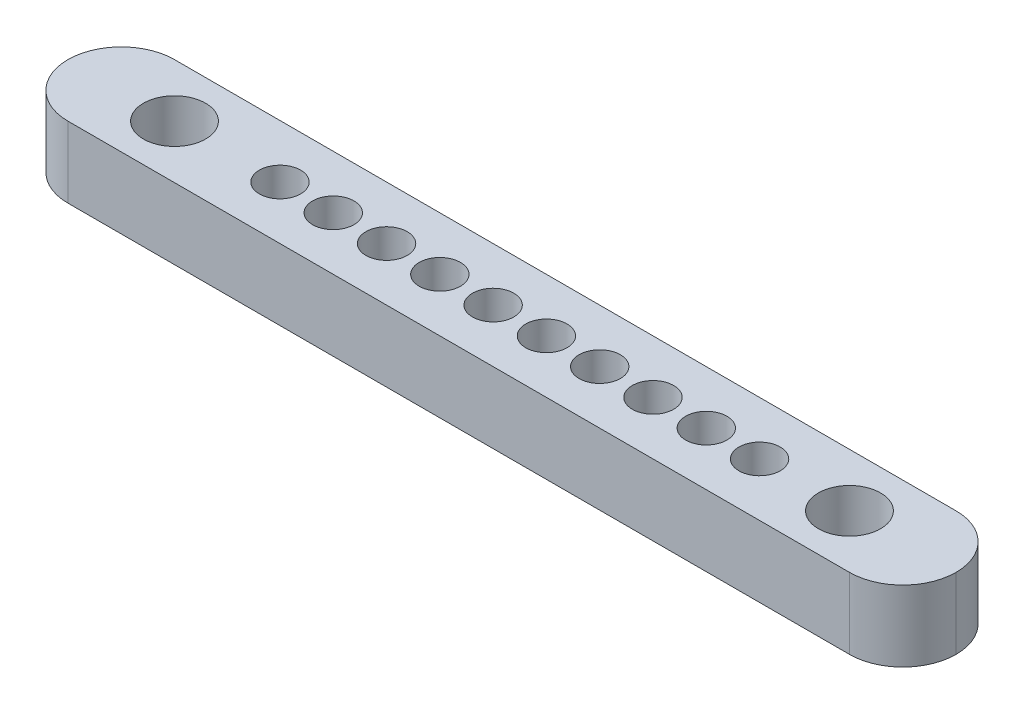
ISO-10303-21;
HEADER;
FILE_DESCRIPTION(('STEP AP214'),'2;1');
FILE_NAME('part.step','',(''),(''),'','','');
FILE_SCHEMA(('AUTOMOTIVE_DESIGN { 1 0 10303 214 1 1 1 1 }'));
ENDSEC;
DATA;
#1=APPLICATION_CONTEXT('core data for automotive mechanical design processes');
#2=APPLICATION_PROTOCOL_DEFINITION('international standard','automotive_design',2000,#1);
#3=PRODUCT_CONTEXT('',#1,'mechanical');
#4=PRODUCT('Part','Part','',(#3));
#5=PRODUCT_RELATED_PRODUCT_CATEGORY('part','',(#4));
#6=PRODUCT_DEFINITION_FORMATION('','',#4);
#7=PRODUCT_DEFINITION_CONTEXT('part definition',#1,'design');
#8=PRODUCT_DEFINITION('design','',#6,#7);
#9=PRODUCT_DEFINITION_SHAPE('','',#8);
#10=(LENGTH_UNIT() NAMED_UNIT(*) SI_UNIT(.MILLI.,.METRE.));
#11=(NAMED_UNIT(*) PLANE_ANGLE_UNIT() SI_UNIT($,.RADIAN.));
#12=(NAMED_UNIT(*) SI_UNIT($,.STERADIAN.) SOLID_ANGLE_UNIT());
#13=UNCERTAINTY_MEASURE_WITH_UNIT(LENGTH_MEASURE(1.E-05),#10,'distance_accuracy_value','');
#14=(GEOMETRIC_REPRESENTATION_CONTEXT(3) GLOBAL_UNCERTAINTY_ASSIGNED_CONTEXT((#13)) GLOBAL_UNIT_ASSIGNED_CONTEXT((#10,
#11,#12)) REPRESENTATION_CONTEXT('',''));
#15=CARTESIAN_POINT('',(0.,0.,0.));
#16=DIRECTION('',(0.,0.,1.));
#17=DIRECTION('',(1.,0.,0.));
#18=AXIS2_PLACEMENT_3D('',#15,#16,#17);
#19=CARTESIAN_POINT('',(0.,4.,0.));
#20=DIRECTION('',(0.,1.,0.));
#21=DIRECTION('',(0.,0.,1.));
#22=AXIS2_PLACEMENT_3D('',#19,#20,#21);
#23=PLANE('',#22);
#24=CARTESIAN_POINT('',(10.937984496124,4.,0.));
#25=DIRECTION('',(0.,1.,0.));
#26=DIRECTION('',(0.,0.,1.));
#27=AXIS2_PLACEMENT_3D('',#24,#25,#26);
#28=CIRCLE('',#27,1.16279069767442);
#29=CARTESIAN_POINT('',(10.937984496124,4.,1.16279069767442));
#30=VERTEX_POINT('',#29);
#31=EDGE_CURVE('E160',#30,#30,#28,.T.);
#32=ORIENTED_EDGE('',*,*,#31,.F.);
#33=EDGE_LOOP('',(#32));
#34=FACE_BOUND('',#33,.T.);
#35=CARTESIAN_POINT('',(4.93798449612403,4.,0.));
#36=DIRECTION('',(0.,1.,0.));
#37=DIRECTION('',(0.,0.,1.));
#38=AXIS2_PLACEMENT_3D('',#35,#36,#37);
#39=CIRCLE('',#38,1.16279069767442);
#40=CARTESIAN_POINT('',(4.93798449612403,4.,1.16279069767442));
#41=VERTEX_POINT('',#40);
#42=EDGE_CURVE('E176',#41,#41,#39,.T.);
#43=ORIENTED_EDGE('',*,*,#42,.F.);
#44=EDGE_LOOP('',(#43));
#45=FACE_BOUND('',#44,.T.);
#46=CARTESIAN_POINT('',(-1.06201550387597,4.,0.));
#47=DIRECTION('',(0.,1.,0.));
#48=DIRECTION('',(0.,0.,1.));
#49=AXIS2_PLACEMENT_3D('',#46,#47,#48);
#50=CIRCLE('',#49,1.16279069767442);
#51=CARTESIAN_POINT('',(-1.06201550387597,4.,1.16279069767442));
#52=VERTEX_POINT('',#51);
#53=EDGE_CURVE('E192',#52,#52,#50,.T.);
#54=ORIENTED_EDGE('',*,*,#53,.F.);
#55=EDGE_LOOP('',(#54));
#56=FACE_BOUND('',#55,.T.);
#57=CARTESIAN_POINT('',(-7.06201550387597,4.,0.));
#58=DIRECTION('',(0.,1.,0.));
#59=DIRECTION('',(0.,0.,1.));
#60=AXIS2_PLACEMENT_3D('',#57,#58,#59);
#61=CIRCLE('',#60,1.16279069767442);
#62=CARTESIAN_POINT('',(-7.06201550387597,4.,1.16279069767442));
#63=VERTEX_POINT('',#62);
#64=EDGE_CURVE('E208',#63,#63,#61,.T.);
#65=ORIENTED_EDGE('',*,*,#64,.F.);
#66=EDGE_LOOP('',(#65));
#67=FACE_BOUND('',#66,.T.);
#68=CARTESIAN_POINT('',(-13.062015503876,4.,0.));
#69=DIRECTION('',(0.,1.,0.));
#70=DIRECTION('',(0.,0.,1.));
#71=AXIS2_PLACEMENT_3D('',#68,#69,#70);
#72=CIRCLE('',#71,1.16279069767442);
#73=CARTESIAN_POINT('',(-13.062015503876,4.,1.16279069767442));
#74=VERTEX_POINT('',#73);
#75=EDGE_CURVE('E224',#74,#74,#72,.T.);
#76=ORIENTED_EDGE('',*,*,#75,.F.);
#77=EDGE_LOOP('',(#76));
#78=FACE_BOUND('',#77,.T.);
#79=CARTESIAN_POINT('',(-19.,4.,0.));
#80=DIRECTION('',(0.,1.,0.));
#81=DIRECTION('',(0.,0.,1.));
#82=AXIS2_PLACEMENT_3D('',#79,#80,#81);
#83=CIRCLE('',#82,1.75);
#84=CARTESIAN_POINT('',(-19.,4.,1.75));
#85=VERTEX_POINT('',#84);
#86=EDGE_CURVE('E240',#85,#85,#83,.T.);
#87=ORIENTED_EDGE('',*,*,#86,.F.);
#88=EDGE_LOOP('',(#87));
#89=FACE_BOUND('',#88,.T.);
#90=DIRECTION('',(1.,0.,0.));
#91=VECTOR('',#90,1.);
#92=CARTESIAN_POINT('',(25.,4.,3.));
#93=LINE('',#92,#91);
#94=CARTESIAN_POINT('',(-22.,4.,3.));
#95=VERTEX_POINT('',#94);
#96=CARTESIAN_POINT('',(22.,4.,3.));
#97=VERTEX_POINT('',#96);
#98=EDGE_CURVE('E247',#95,#97,#93,.T.);
#99=ORIENTED_EDGE('',*,*,#98,.T.);
#100=CARTESIAN_POINT('',(22.,4.,0.));
#101=DIRECTION('',(0.,1.,0.));
#102=DIRECTION('',(0.,0.,1.));
#103=AXIS2_PLACEMENT_3D('',#100,#101,#102);
#104=CIRCLE('',#103,3.);
#105=CARTESIAN_POINT('',(25.,4.,0.));
#106=VERTEX_POINT('',#105);
#107=EDGE_CURVE('E139',#97,#106,#104,.T.);
#108=ORIENTED_EDGE('',*,*,#107,.T.);
#109=CARTESIAN_POINT('',(22.,4.,0.));
#110=DIRECTION('',(0.,1.,0.));
#111=DIRECTION('',(0.,0.,1.));
#112=AXIS2_PLACEMENT_3D('',#109,#110,#111);
#113=CIRCLE('',#112,3.);
#114=CARTESIAN_POINT('',(22.,4.,-3.));
#115=VERTEX_POINT('',#114);
#116=EDGE_CURVE('E65',#106,#115,#113,.T.);
#117=ORIENTED_EDGE('',*,*,#116,.T.);
#118=DIRECTION('',(-1.,0.,0.));
#119=VECTOR('',#118,1.);
#120=CARTESIAN_POINT('',(25.,4.,-3.));
#121=LINE('',#120,#119);
#122=CARTESIAN_POINT('',(-22.,4.,-3.));
#123=VERTEX_POINT('',#122);
#124=EDGE_CURVE('E109',#115,#123,#121,.T.);
#125=ORIENTED_EDGE('',*,*,#124,.T.);
#126=CARTESIAN_POINT('',(-22.,4.,0.));
#127=DIRECTION('',(0.,1.,0.));
#128=DIRECTION('',(0.,0.,1.));
#129=AXIS2_PLACEMENT_3D('',#126,#127,#128);
#130=CIRCLE('',#129,3.);
#131=CARTESIAN_POINT('',(-25.,4.,0.));
#132=VERTEX_POINT('',#131);
#133=EDGE_CURVE('E57',#123,#132,#130,.T.);
#134=ORIENTED_EDGE('',*,*,#133,.T.);
#135=CARTESIAN_POINT('',(-22.,4.,0.));
#136=DIRECTION('',(0.,1.,0.));
#137=DIRECTION('',(0.,0.,1.));
#138=AXIS2_PLACEMENT_3D('',#135,#136,#137);
#139=CIRCLE('',#138,3.);
#140=EDGE_CURVE('E112',#132,#95,#139,.T.);
#141=ORIENTED_EDGE('',*,*,#140,.T.);
#142=EDGE_LOOP('',(#99,#108,#117,#125,#134,#141));
#143=FACE_BOUND('',#142,.T.);
#144=CARTESIAN_POINT('',(19.,4.,0.));
#145=DIRECTION('',(0.,1.,0.));
#146=DIRECTION('',(0.,0.,1.));
#147=AXIS2_PLACEMENT_3D('',#144,#145,#146);
#148=CIRCLE('',#147,1.75);
#149=CARTESIAN_POINT('',(19.,4.,1.75));
#150=VERTEX_POINT('',#149);
#151=EDGE_CURVE('E232',#150,#150,#148,.T.);
#152=ORIENTED_EDGE('',*,*,#151,.F.);
#153=EDGE_LOOP('',(#152));
#154=FACE_BOUND('',#153,.T.);
#155=CARTESIAN_POINT('',(-10.062015503876,4.,0.));
#156=DIRECTION('',(0.,1.,0.));
#157=DIRECTION('',(0.,0.,1.));
#158=AXIS2_PLACEMENT_3D('',#155,#156,#157);
#159=CIRCLE('',#158,1.16279069767442);
#160=CARTESIAN_POINT('',(-10.062015503876,4.,1.16279069767442));
#161=VERTEX_POINT('',#160);
#162=EDGE_CURVE('E216',#161,#161,#159,.T.);
#163=ORIENTED_EDGE('',*,*,#162,.F.);
#164=EDGE_LOOP('',(#163));
#165=FACE_BOUND('',#164,.T.);
#166=CARTESIAN_POINT('',(-4.06201550387597,4.,0.));
#167=DIRECTION('',(0.,1.,0.));
#168=DIRECTION('',(0.,0.,1.));
#169=AXIS2_PLACEMENT_3D('',#166,#167,#168);
#170=CIRCLE('',#169,1.16279069767442);
#171=CARTESIAN_POINT('',(-4.06201550387597,4.,1.16279069767442));
#172=VERTEX_POINT('',#171);
#173=EDGE_CURVE('E200',#172,#172,#170,.T.);
#174=ORIENTED_EDGE('',*,*,#173,.F.);
#175=EDGE_LOOP('',(#174));
#176=FACE_BOUND('',#175,.T.);
#177=CARTESIAN_POINT('',(1.93798449612403,4.,0.));
#178=DIRECTION('',(0.,1.,0.));
#179=DIRECTION('',(0.,0.,1.));
#180=AXIS2_PLACEMENT_3D('',#177,#178,#179);
#181=CIRCLE('',#180,1.16279069767442);
#182=CARTESIAN_POINT('',(1.93798449612403,4.,1.16279069767442));
#183=VERTEX_POINT('',#182);
#184=EDGE_CURVE('E184',#183,#183,#181,.T.);
#185=ORIENTED_EDGE('',*,*,#184,.F.);
#186=EDGE_LOOP('',(#185));
#187=FACE_BOUND('',#186,.T.);
#188=CARTESIAN_POINT('',(7.93798449612403,4.,0.));
#189=DIRECTION('',(0.,1.,0.));
#190=DIRECTION('',(0.,0.,1.));
#191=AXIS2_PLACEMENT_3D('',#188,#189,#190);
#192=CIRCLE('',#191,1.16279069767442);
#193=CARTESIAN_POINT('',(7.93798449612403,4.,1.16279069767442));
#194=VERTEX_POINT('',#193);
#195=EDGE_CURVE('E168',#194,#194,#192,.T.);
#196=ORIENTED_EDGE('',*,*,#195,.F.);
#197=EDGE_LOOP('',(#196));
#198=FACE_BOUND('',#197,.T.);
#199=CARTESIAN_POINT('',(13.937984496124,4.,0.));
#200=DIRECTION('',(0.,1.,0.));
#201=DIRECTION('',(0.,0.,1.));
#202=AXIS2_PLACEMENT_3D('',#199,#200,#201);
#203=CIRCLE('',#202,1.16279069767442);
#204=CARTESIAN_POINT('',(13.937984496124,4.,1.16279069767442));
#205=VERTEX_POINT('',#204);
#206=EDGE_CURVE('E151',#205,#205,#203,.T.);
#207=ORIENTED_EDGE('',*,*,#206,.F.);
#208=EDGE_LOOP('',(#207));
#209=FACE_BOUND('',#208,.T.);
#210=ADVANCED_FACE('F39',(#34,#45,#56,#67,#78,#89,#143,#154,#165,#176,#187,#198,#209),#23,.T.);
#211=CARTESIAN_POINT('',(0.,0.,0.));
#212=DIRECTION('',(0.,1.,0.));
#213=DIRECTION('',(0.,0.,1.));
#214=AXIS2_PLACEMENT_3D('',#211,#212,#213);
#215=PLANE('',#214);
#216=CARTESIAN_POINT('',(22.,0.,0.));
#217=DIRECTION('',(0.,1.,0.));
#218=DIRECTION('',(0.,0.,1.));
#219=AXIS2_PLACEMENT_3D('',#216,#217,#218);
#220=CIRCLE('',#219,3.);
#221=CARTESIAN_POINT('',(22.,0.,-3.));
#222=VERTEX_POINT('',#221);
#223=CARTESIAN_POINT('',(25.,0.,0.));
#224=VERTEX_POINT('',#223);
#225=EDGE_CURVE('E117',#222,#224,#220,.F.);
#226=ORIENTED_EDGE('',*,*,#225,.T.);
#227=CARTESIAN_POINT('',(22.,0.,0.));
#228=DIRECTION('',(0.,1.,0.));
#229=DIRECTION('',(0.,0.,1.));
#230=AXIS2_PLACEMENT_3D('',#227,#228,#229);
#231=CIRCLE('',#230,3.);
#232=CARTESIAN_POINT('',(22.,0.,3.));
#233=VERTEX_POINT('',#232);
#234=EDGE_CURVE('E120',#224,#233,#231,.F.);
#235=ORIENTED_EDGE('',*,*,#234,.T.);
#236=DIRECTION('',(1.,0.,0.));
#237=VECTOR('',#236,1.);
#238=CARTESIAN_POINT('',(25.,0.,3.));
#239=LINE('',#238,#237);
#240=CARTESIAN_POINT('',(-22.,0.,3.));
#241=VERTEX_POINT('',#240);
#242=EDGE_CURVE('E105',#241,#233,#239,.T.);
#243=ORIENTED_EDGE('',*,*,#242,.F.);
#244=CARTESIAN_POINT('',(-22.,0.,0.));
#245=DIRECTION('',(0.,1.,0.));
#246=DIRECTION('',(0.,0.,1.));
#247=AXIS2_PLACEMENT_3D('',#244,#245,#246);
#248=CIRCLE('',#247,3.);
#249=CARTESIAN_POINT('',(-25.,0.,0.));
#250=VERTEX_POINT('',#249);
#251=EDGE_CURVE('E96',#241,#250,#248,.F.);
#252=ORIENTED_EDGE('',*,*,#251,.T.);
#253=CARTESIAN_POINT('',(-22.,0.,0.));
#254=DIRECTION('',(0.,1.,0.));
#255=DIRECTION('',(0.,0.,1.));
#256=AXIS2_PLACEMENT_3D('',#253,#254,#255);
#257=CIRCLE('',#256,3.);
#258=CARTESIAN_POINT('',(-22.,0.,-3.));
#259=VERTEX_POINT('',#258);
#260=EDGE_CURVE('E102',#250,#259,#257,.F.);
#261=ORIENTED_EDGE('',*,*,#260,.T.);
#262=DIRECTION('',(-1.,0.,0.));
#263=VECTOR('',#262,1.);
#264=CARTESIAN_POINT('',(25.,0.,-3.));
#265=LINE('',#264,#263);
#266=EDGE_CURVE('E251',#222,#259,#265,.T.);
#267=ORIENTED_EDGE('',*,*,#266,.F.);
#268=EDGE_LOOP('',(#226,#235,#243,#252,#261,#267));
#269=FACE_BOUND('',#268,.T.);
#270=CARTESIAN_POINT('',(-19.,0.,0.));
#271=DIRECTION('',(0.,1.,0.));
#272=DIRECTION('',(0.,0.,1.));
#273=AXIS2_PLACEMENT_3D('',#270,#271,#272);
#274=CIRCLE('',#273,1.75);
#275=CARTESIAN_POINT('',(-19.,0.,1.75));
#276=VERTEX_POINT('',#275);
#277=EDGE_CURVE('E236',#276,#276,#274,.T.);
#278=ORIENTED_EDGE('',*,*,#277,.T.);
#279=EDGE_LOOP('',(#278));
#280=FACE_BOUND('',#279,.T.);
#281=CARTESIAN_POINT('',(19.,0.,0.));
#282=DIRECTION('',(0.,1.,0.));
#283=DIRECTION('',(0.,0.,1.));
#284=AXIS2_PLACEMENT_3D('',#281,#282,#283);
#285=CIRCLE('',#284,1.75);
#286=CARTESIAN_POINT('',(19.,0.,1.75));
#287=VERTEX_POINT('',#286);
#288=EDGE_CURVE('E228',#287,#287,#285,.T.);
#289=ORIENTED_EDGE('',*,*,#288,.T.);
#290=EDGE_LOOP('',(#289));
#291=FACE_BOUND('',#290,.T.);
#292=CARTESIAN_POINT('',(-13.062015503876,0.,0.));
#293=DIRECTION('',(0.,1.,0.));
#294=DIRECTION('',(0.,0.,1.));
#295=AXIS2_PLACEMENT_3D('',#292,#293,#294);
#296=CIRCLE('',#295,1.16279069767442);
#297=CARTESIAN_POINT('',(-13.062015503876,0.,1.16279069767442));
#298=VERTEX_POINT('',#297);
#299=EDGE_CURVE('E220',#298,#298,#296,.T.);
#300=ORIENTED_EDGE('',*,*,#299,.T.);
#301=EDGE_LOOP('',(#300));
#302=FACE_BOUND('',#301,.T.);
#303=CARTESIAN_POINT('',(-10.062015503876,0.,0.));
#304=DIRECTION('',(0.,1.,0.));
#305=DIRECTION('',(0.,0.,1.));
#306=AXIS2_PLACEMENT_3D('',#303,#304,#305);
#307=CIRCLE('',#306,1.16279069767442);
#308=CARTESIAN_POINT('',(-10.062015503876,0.,1.16279069767442));
#309=VERTEX_POINT('',#308);
#310=EDGE_CURVE('E212',#309,#309,#307,.T.);
#311=ORIENTED_EDGE('',*,*,#310,.T.);
#312=EDGE_LOOP('',(#311));
#313=FACE_BOUND('',#312,.T.);
#314=CARTESIAN_POINT('',(-7.06201550387597,0.,0.));
#315=DIRECTION('',(0.,1.,0.));
#316=DIRECTION('',(0.,0.,1.));
#317=AXIS2_PLACEMENT_3D('',#314,#315,#316);
#318=CIRCLE('',#317,1.16279069767442);
#319=CARTESIAN_POINT('',(-7.06201550387597,0.,1.16279069767442));
#320=VERTEX_POINT('',#319);
#321=EDGE_CURVE('E204',#320,#320,#318,.T.);
#322=ORIENTED_EDGE('',*,*,#321,.T.);
#323=EDGE_LOOP('',(#322));
#324=FACE_BOUND('',#323,.T.);
#325=CARTESIAN_POINT('',(-4.06201550387597,0.,0.));
#326=DIRECTION('',(0.,1.,0.));
#327=DIRECTION('',(0.,0.,1.));
#328=AXIS2_PLACEMENT_3D('',#325,#326,#327);
#329=CIRCLE('',#328,1.16279069767442);
#330=CARTESIAN_POINT('',(-4.06201550387597,0.,1.16279069767442));
#331=VERTEX_POINT('',#330);
#332=EDGE_CURVE('E196',#331,#331,#329,.T.);
#333=ORIENTED_EDGE('',*,*,#332,.T.);
#334=EDGE_LOOP('',(#333));
#335=FACE_BOUND('',#334,.T.);
#336=CARTESIAN_POINT('',(-1.06201550387597,0.,0.));
#337=DIRECTION('',(0.,1.,0.));
#338=DIRECTION('',(0.,0.,1.));
#339=AXIS2_PLACEMENT_3D('',#336,#337,#338);
#340=CIRCLE('',#339,1.16279069767442);
#341=CARTESIAN_POINT('',(-1.06201550387597,0.,1.16279069767442));
#342=VERTEX_POINT('',#341);
#343=EDGE_CURVE('E188',#342,#342,#340,.T.);
#344=ORIENTED_EDGE('',*,*,#343,.T.);
#345=EDGE_LOOP('',(#344));
#346=FACE_BOUND('',#345,.T.);
#347=CARTESIAN_POINT('',(1.93798449612403,0.,0.));
#348=DIRECTION('',(0.,1.,0.));
#349=DIRECTION('',(0.,0.,1.));
#350=AXIS2_PLACEMENT_3D('',#347,#348,#349);
#351=CIRCLE('',#350,1.16279069767442);
#352=CARTESIAN_POINT('',(1.93798449612403,0.,1.16279069767442));
#353=VERTEX_POINT('',#352);
#354=EDGE_CURVE('E180',#353,#353,#351,.T.);
#355=ORIENTED_EDGE('',*,*,#354,.T.);
#356=EDGE_LOOP('',(#355));
#357=FACE_BOUND('',#356,.T.);
#358=CARTESIAN_POINT('',(4.93798449612403,0.,0.));
#359=DIRECTION('',(0.,1.,0.));
#360=DIRECTION('',(0.,0.,1.));
#361=AXIS2_PLACEMENT_3D('',#358,#359,#360);
#362=CIRCLE('',#361,1.16279069767442);
#363=CARTESIAN_POINT('',(4.93798449612403,0.,1.16279069767442));
#364=VERTEX_POINT('',#363);
#365=EDGE_CURVE('E172',#364,#364,#362,.T.);
#366=ORIENTED_EDGE('',*,*,#365,.T.);
#367=EDGE_LOOP('',(#366));
#368=FACE_BOUND('',#367,.T.);
#369=CARTESIAN_POINT('',(7.93798449612403,0.,0.));
#370=DIRECTION('',(0.,1.,0.));
#371=DIRECTION('',(0.,0.,1.));
#372=AXIS2_PLACEMENT_3D('',#369,#370,#371);
#373=CIRCLE('',#372,1.16279069767442);
#374=CARTESIAN_POINT('',(7.93798449612403,0.,1.16279069767442));
#375=VERTEX_POINT('',#374);
#376=EDGE_CURVE('E164',#375,#375,#373,.T.);
#377=ORIENTED_EDGE('',*,*,#376,.T.);
#378=EDGE_LOOP('',(#377));
#379=FACE_BOUND('',#378,.T.);
#380=CARTESIAN_POINT('',(10.937984496124,0.,0.));
#381=DIRECTION('',(0.,1.,0.));
#382=DIRECTION('',(0.,0.,1.));
#383=AXIS2_PLACEMENT_3D('',#380,#381,#382);
#384=CIRCLE('',#383,1.16279069767442);
#385=CARTESIAN_POINT('',(10.937984496124,0.,1.16279069767442));
#386=VERTEX_POINT('',#385);
#387=EDGE_CURVE('E157',#386,#386,#384,.T.);
#388=ORIENTED_EDGE('',*,*,#387,.T.);
#389=EDGE_LOOP('',(#388));
#390=FACE_BOUND('',#389,.T.);
#391=CARTESIAN_POINT('',(13.937984496124,0.,0.));
#392=DIRECTION('',(0.,1.,0.));
#393=DIRECTION('',(0.,0.,1.));
#394=AXIS2_PLACEMENT_3D('',#391,#392,#393);
#395=CIRCLE('',#394,1.16279069767442);
#396=CARTESIAN_POINT('',(13.937984496124,0.,1.16279069767442));
#397=VERTEX_POINT('',#396);
#398=EDGE_CURVE('E145',#397,#397,#395,.T.);
#399=ORIENTED_EDGE('',*,*,#398,.T.);
#400=EDGE_LOOP('',(#399));
#401=FACE_BOUND('',#400,.T.);
#402=ADVANCED_FACE('F98',(#269,#280,#291,#302,#313,#324,#335,#346,#357,#368,#379,#390,#401),
#215,.F.);
#403=CARTESIAN_POINT('',(25.,4.,3.));
#404=DIRECTION('',(0.,0.,-1.));
#405=DIRECTION('',(-1.,0.,0.));
#406=AXIS2_PLACEMENT_3D('',#403,#404,#405);
#407=PLANE('',#406);
#408=ORIENTED_EDGE('',*,*,#242,.T.);
#409=DIRECTION('',(0.,-1.,0.));
#410=VECTOR('',#409,1.);
#411=CARTESIAN_POINT('',(22.,4.,3.));
#412=LINE('',#411,#410);
#413=EDGE_CURVE('E129',#233,#97,#412,.F.);
#414=ORIENTED_EDGE('',*,*,#413,.T.);
#415=ORIENTED_EDGE('',*,*,#98,.F.);
#416=DIRECTION('',(0.,-1.,0.));
#417=VECTOR('',#416,1.);
#418=CARTESIAN_POINT('',(-22.,4.,3.));
#419=LINE('',#418,#417);
#420=EDGE_CURVE('E126',#95,#241,#419,.T.);
#421=ORIENTED_EDGE('',*,*,#420,.T.);
#422=EDGE_LOOP('',(#408,#414,#415,#421));
#423=FACE_BOUND('',#422,.T.);
#424=ADVANCED_FACE('F265',(#423),#407,.F.);
#425=CARTESIAN_POINT('',(25.,4.,-3.));
#426=DIRECTION('',(0.,0.,1.));
#427=DIRECTION('',(1.,0.,0.));
#428=AXIS2_PLACEMENT_3D('',#425,#426,#427);
#429=PLANE('',#428);
#430=ORIENTED_EDGE('',*,*,#124,.F.);
#431=DIRECTION('',(0.,-1.,0.));
#432=VECTOR('',#431,1.);
#433=CARTESIAN_POINT('',(22.,4.,-3.));
#434=LINE('',#433,#432);
#435=EDGE_CURVE('E11',#115,#222,#434,.T.);
#436=ORIENTED_EDGE('',*,*,#435,.T.);
#437=ORIENTED_EDGE('',*,*,#266,.T.);
#438=DIRECTION('',(0.,-1.,0.));
#439=VECTOR('',#438,1.);
#440=CARTESIAN_POINT('',(-22.,4.,-3.));
#441=LINE('',#440,#439);
#442=EDGE_CURVE('E49',#259,#123,#441,.F.);
#443=ORIENTED_EDGE('',*,*,#442,.T.);
#444=EDGE_LOOP('',(#430,#436,#437,#443));
#445=FACE_BOUND('',#444,.T.);
#446=ADVANCED_FACE('F257',(#445),#429,.F.);
#447=CARTESIAN_POINT('',(-19.,4.,0.));
#448=DIRECTION('',(0.,-1.,0.));
#449=DIRECTION('',(0.,0.,-1.));
#450=AXIS2_PLACEMENT_3D('',#447,#448,#449);
#451=CYLINDRICAL_SURFACE('',#450,1.75);
#452=ORIENTED_EDGE('',*,*,#86,.T.);
#453=EDGE_LOOP('',(#452));
#454=FACE_BOUND('',#453,.T.);
#455=ORIENTED_EDGE('',*,*,#277,.F.);
#456=EDGE_LOOP('',(#455));
#457=FACE_BOUND('',#456,.T.);
#458=ADVANCED_FACE('F331',(#454,#457),#451,.F.);
#459=CARTESIAN_POINT('',(19.,4.,0.));
#460=DIRECTION('',(0.,-1.,0.));
#461=DIRECTION('',(0.,0.,-1.));
#462=AXIS2_PLACEMENT_3D('',#459,#460,#461);
#463=CYLINDRICAL_SURFACE('',#462,1.75);
#464=ORIENTED_EDGE('',*,*,#151,.T.);
#465=EDGE_LOOP('',(#464));
#466=FACE_BOUND('',#465,.T.);
#467=ORIENTED_EDGE('',*,*,#288,.F.);
#468=EDGE_LOOP('',(#467));
#469=FACE_BOUND('',#468,.T.);
#470=ADVANCED_FACE('F327',(#466,#469),#463,.F.);
#471=CARTESIAN_POINT('',(-13.062015503876,4.,0.));
#472=DIRECTION('',(0.,-1.,0.));
#473=DIRECTION('',(0.,0.,-1.));
#474=AXIS2_PLACEMENT_3D('',#471,#472,#473);
#475=CYLINDRICAL_SURFACE('',#474,1.16279069767442);
#476=ORIENTED_EDGE('',*,*,#75,.T.);
#477=EDGE_LOOP('',(#476));
#478=FACE_BOUND('',#477,.T.);
#479=ORIENTED_EDGE('',*,*,#299,.F.);
#480=EDGE_LOOP('',(#479));
#481=FACE_BOUND('',#480,.T.);
#482=ADVANCED_FACE('F323',(#478,#481),#475,.F.);
#483=CARTESIAN_POINT('',(-10.062015503876,4.,0.));
#484=DIRECTION('',(0.,-1.,0.));
#485=DIRECTION('',(0.,0.,-1.));
#486=AXIS2_PLACEMENT_3D('',#483,#484,#485);
#487=CYLINDRICAL_SURFACE('',#486,1.16279069767442);
#488=ORIENTED_EDGE('',*,*,#162,.T.);
#489=EDGE_LOOP('',(#488));
#490=FACE_BOUND('',#489,.T.);
#491=ORIENTED_EDGE('',*,*,#310,.F.);
#492=EDGE_LOOP('',(#491));
#493=FACE_BOUND('',#492,.T.);
#494=ADVANCED_FACE('F319',(#490,#493),#487,.F.);
#495=CARTESIAN_POINT('',(-7.06201550387597,4.,0.));
#496=DIRECTION('',(0.,-1.,0.));
#497=DIRECTION('',(0.,0.,-1.));
#498=AXIS2_PLACEMENT_3D('',#495,#496,#497);
#499=CYLINDRICAL_SURFACE('',#498,1.16279069767442);
#500=ORIENTED_EDGE('',*,*,#64,.T.);
#501=EDGE_LOOP('',(#500));
#502=FACE_BOUND('',#501,.T.);
#503=ORIENTED_EDGE('',*,*,#321,.F.);
#504=EDGE_LOOP('',(#503));
#505=FACE_BOUND('',#504,.T.);
#506=ADVANCED_FACE('F315',(#502,#505),#499,.F.);
#507=CARTESIAN_POINT('',(-4.06201550387597,4.,0.));
#508=DIRECTION('',(0.,-1.,0.));
#509=DIRECTION('',(0.,0.,-1.));
#510=AXIS2_PLACEMENT_3D('',#507,#508,#509);
#511=CYLINDRICAL_SURFACE('',#510,1.16279069767442);
#512=ORIENTED_EDGE('',*,*,#173,.T.);
#513=EDGE_LOOP('',(#512));
#514=FACE_BOUND('',#513,.T.);
#515=ORIENTED_EDGE('',*,*,#332,.F.);
#516=EDGE_LOOP('',(#515));
#517=FACE_BOUND('',#516,.T.);
#518=ADVANCED_FACE('F311',(#514,#517),#511,.F.);
#519=CARTESIAN_POINT('',(-1.06201550387597,4.,0.));
#520=DIRECTION('',(0.,-1.,0.));
#521=DIRECTION('',(0.,0.,-1.));
#522=AXIS2_PLACEMENT_3D('',#519,#520,#521);
#523=CYLINDRICAL_SURFACE('',#522,1.16279069767442);
#524=ORIENTED_EDGE('',*,*,#53,.T.);
#525=EDGE_LOOP('',(#524));
#526=FACE_BOUND('',#525,.T.);
#527=ORIENTED_EDGE('',*,*,#343,.F.);
#528=EDGE_LOOP('',(#527));
#529=FACE_BOUND('',#528,.T.);
#530=ADVANCED_FACE('F307',(#526,#529),#523,.F.);
#531=CARTESIAN_POINT('',(1.93798449612403,4.,0.));
#532=DIRECTION('',(0.,-1.,0.));
#533=DIRECTION('',(0.,0.,-1.));
#534=AXIS2_PLACEMENT_3D('',#531,#532,#533);
#535=CYLINDRICAL_SURFACE('',#534,1.16279069767442);
#536=ORIENTED_EDGE('',*,*,#184,.T.);
#537=EDGE_LOOP('',(#536));
#538=FACE_BOUND('',#537,.T.);
#539=ORIENTED_EDGE('',*,*,#354,.F.);
#540=EDGE_LOOP('',(#539));
#541=FACE_BOUND('',#540,.T.);
#542=ADVANCED_FACE('F303',(#538,#541),#535,.F.);
#543=CARTESIAN_POINT('',(4.93798449612403,4.,0.));
#544=DIRECTION('',(0.,-1.,0.));
#545=DIRECTION('',(0.,0.,-1.));
#546=AXIS2_PLACEMENT_3D('',#543,#544,#545);
#547=CYLINDRICAL_SURFACE('',#546,1.16279069767442);
#548=ORIENTED_EDGE('',*,*,#42,.T.);
#549=EDGE_LOOP('',(#548));
#550=FACE_BOUND('',#549,.T.);
#551=ORIENTED_EDGE('',*,*,#365,.F.);
#552=EDGE_LOOP('',(#551));
#553=FACE_BOUND('',#552,.T.);
#554=ADVANCED_FACE('F299',(#550,#553),#547,.F.);
#555=CARTESIAN_POINT('',(7.93798449612403,4.,0.));
#556=DIRECTION('',(0.,-1.,0.));
#557=DIRECTION('',(0.,0.,-1.));
#558=AXIS2_PLACEMENT_3D('',#555,#556,#557);
#559=CYLINDRICAL_SURFACE('',#558,1.16279069767442);
#560=ORIENTED_EDGE('',*,*,#195,.T.);
#561=EDGE_LOOP('',(#560));
#562=FACE_BOUND('',#561,.T.);
#563=ORIENTED_EDGE('',*,*,#376,.F.);
#564=EDGE_LOOP('',(#563));
#565=FACE_BOUND('',#564,.T.);
#566=ADVANCED_FACE('F293',(#562,#565),#559,.F.);
#567=CARTESIAN_POINT('',(10.937984496124,4.,0.));
#568=DIRECTION('',(0.,-1.,0.));
#569=DIRECTION('',(0.,0.,-1.));
#570=AXIS2_PLACEMENT_3D('',#567,#568,#569);
#571=CYLINDRICAL_SURFACE('',#570,1.16279069767442);
#572=ORIENTED_EDGE('',*,*,#31,.T.);
#573=EDGE_LOOP('',(#572));
#574=FACE_BOUND('',#573,.T.);
#575=ORIENTED_EDGE('',*,*,#387,.F.);
#576=EDGE_LOOP('',(#575));
#577=FACE_BOUND('',#576,.T.);
#578=ADVANCED_FACE('F286',(#574,#577),#571,.F.);
#579=CARTESIAN_POINT('',(13.937984496124,4.,0.));
#580=DIRECTION('',(0.,-1.,0.));
#581=DIRECTION('',(0.,0.,-1.));
#582=AXIS2_PLACEMENT_3D('',#579,#580,#581);
#583=CYLINDRICAL_SURFACE('',#582,1.16279069767442);
#584=ORIENTED_EDGE('',*,*,#206,.T.);
#585=EDGE_LOOP('',(#584));
#586=FACE_BOUND('',#585,.T.);
#587=ORIENTED_EDGE('',*,*,#398,.F.);
#588=EDGE_LOOP('',(#587));
#589=FACE_BOUND('',#588,.T.);
#590=ADVANCED_FACE('F283',(#586,#589),#583,.F.);
#591=CARTESIAN_POINT('',(22.,4.,0.));
#592=DIRECTION('',(0.,-1.,0.));
#593=DIRECTION('',(0.,0.,-1.));
#594=AXIS2_PLACEMENT_3D('',#591,#592,#593);
#595=CYLINDRICAL_SURFACE('',#594,3.);
#596=ORIENTED_EDGE('',*,*,#435,.F.);
#597=ORIENTED_EDGE('',*,*,#116,.F.);
#598=DIRECTION('',(0.,-1.,0.));
#599=VECTOR('',#598,1.);
#600=CARTESIAN_POINT('',(25.,4.,0.));
#601=LINE('',#600,#599);
#602=EDGE_CURVE('E114',#224,#106,#601,.F.);
#603=ORIENTED_EDGE('',*,*,#602,.F.);
#604=ORIENTED_EDGE('',*,*,#225,.F.);
#605=EDGE_LOOP('',(#596,#597,#603,#604));
#606=FACE_BOUND('',#605,.T.);
#607=ADVANCED_FACE('F261',(#606),#595,.T.);
#608=CARTESIAN_POINT('',(22.,4.,0.));
#609=DIRECTION('',(0.,-1.,0.));
#610=DIRECTION('',(0.,0.,-1.));
#611=AXIS2_PLACEMENT_3D('',#608,#609,#610);
#612=CYLINDRICAL_SURFACE('',#611,3.);
#613=ORIENTED_EDGE('',*,*,#107,.F.);
#614=ORIENTED_EDGE('',*,*,#413,.F.);
#615=ORIENTED_EDGE('',*,*,#234,.F.);
#616=ORIENTED_EDGE('',*,*,#602,.T.);
#617=EDGE_LOOP('',(#613,#614,#615,#616));
#618=FACE_BOUND('',#617,.T.);
#619=ADVANCED_FACE('F263',(#618),#612,.T.);
#620=CARTESIAN_POINT('',(-22.,4.,0.));
#621=DIRECTION('',(0.,-1.,0.));
#622=DIRECTION('',(0.,0.,-1.));
#623=AXIS2_PLACEMENT_3D('',#620,#621,#622);
#624=CYLINDRICAL_SURFACE('',#623,3.);
#625=ORIENTED_EDGE('',*,*,#420,.F.);
#626=ORIENTED_EDGE('',*,*,#140,.F.);
#627=DIRECTION('',(0.,-1.,0.));
#628=VECTOR('',#627,1.);
#629=CARTESIAN_POINT('',(-25.,4.,0.));
#630=LINE('',#629,#628);
#631=EDGE_CURVE('E43',#250,#132,#630,.F.);
#632=ORIENTED_EDGE('',*,*,#631,.F.);
#633=ORIENTED_EDGE('',*,*,#251,.F.);
#634=EDGE_LOOP('',(#625,#626,#632,#633));
#635=FACE_BOUND('',#634,.T.);
#636=ADVANCED_FACE('F41',(#635),#624,.T.);
#637=CARTESIAN_POINT('',(-22.,4.,0.));
#638=DIRECTION('',(0.,-1.,0.));
#639=DIRECTION('',(0.,0.,-1.));
#640=AXIS2_PLACEMENT_3D('',#637,#638,#639);
#641=CYLINDRICAL_SURFACE('',#640,3.);
#642=ORIENTED_EDGE('',*,*,#133,.F.);
#643=ORIENTED_EDGE('',*,*,#442,.F.);
#644=ORIENTED_EDGE('',*,*,#260,.F.);
#645=ORIENTED_EDGE('',*,*,#631,.T.);
#646=EDGE_LOOP('',(#642,#643,#644,#645));
#647=FACE_BOUND('',#646,.T.);
#648=ADVANCED_FACE('F115',(#647),#641,.T.);
#649=CLOSED_SHELL('',(#210,#402,#424,#446,#458,#470,#482,#494,#506,#518,#530,#542,#554,#566,
#578,#590,#607,#619,#636,#648));
#650=MANIFOLD_SOLID_BREP('B2',#649);
#651=ADVANCED_BREP_SHAPE_REPRESENTATION('',(#18,#650),#14);
#652=SHAPE_DEFINITION_REPRESENTATION(#9,#651);
ENDSEC;
END-ISO-10303-21;
